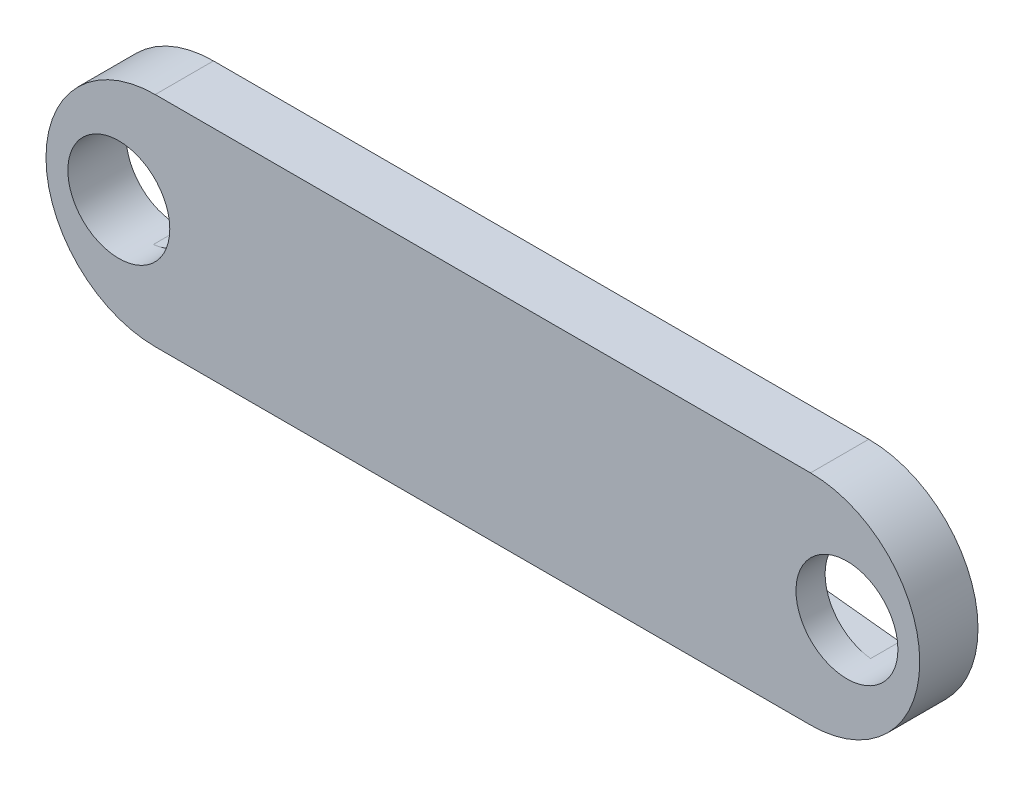
ISO-10303-21;
HEADER;
FILE_DESCRIPTION(('STEP AP214'),'2;1');
FILE_NAME('part.step','',(''),(''),'','','');
FILE_SCHEMA(('AUTOMOTIVE_DESIGN { 1 0 10303 214 1 1 1 1 }'));
ENDSEC;
DATA;
#1=APPLICATION_CONTEXT('core data for automotive mechanical design processes');
#2=APPLICATION_PROTOCOL_DEFINITION('international standard','automotive_design',2000,#1);
#3=PRODUCT_CONTEXT('',#1,'mechanical');
#4=PRODUCT('Part','Part','',(#3));
#5=PRODUCT_RELATED_PRODUCT_CATEGORY('part','',(#4));
#6=PRODUCT_DEFINITION_FORMATION('','',#4);
#7=PRODUCT_DEFINITION_CONTEXT('part definition',#1,'design');
#8=PRODUCT_DEFINITION('design','',#6,#7);
#9=PRODUCT_DEFINITION_SHAPE('','',#8);
#10=(LENGTH_UNIT() NAMED_UNIT(*) SI_UNIT(.MILLI.,.METRE.));
#11=(NAMED_UNIT(*) PLANE_ANGLE_UNIT() SI_UNIT($,.RADIAN.));
#12=(NAMED_UNIT(*) SI_UNIT($,.STERADIAN.) SOLID_ANGLE_UNIT());
#13=UNCERTAINTY_MEASURE_WITH_UNIT(LENGTH_MEASURE(1.E-05),#10,'distance_accuracy_value','');
#14=(GEOMETRIC_REPRESENTATION_CONTEXT(3) GLOBAL_UNCERTAINTY_ASSIGNED_CONTEXT((#13)) GLOBAL_UNIT_ASSIGNED_CONTEXT((#10,
#11,#12)) REPRESENTATION_CONTEXT('',''));
#15=CARTESIAN_POINT('',(0.,0.,0.));
#16=DIRECTION('',(0.,0.,1.));
#17=DIRECTION('',(1.,0.,0.));
#18=AXIS2_PLACEMENT_3D('',#15,#16,#17);
#19=CARTESIAN_POINT('',(-47.5,9.18674698795181,4.));
#20=DIRECTION('',(0.,0.,-1.));
#21=DIRECTION('',(-1.,0.,0.));
#22=AXIS2_PLACEMENT_3D('',#19,#20,#21);
#23=CYLINDRICAL_SURFACE('',#22,7.5);
#24=DIRECTION('',(0.,0.,-1.));
#25=VECTOR('',#24,1.);
#26=CARTESIAN_POINT('',(-47.5,1.68674698795181,4.));
#27=LINE('',#26,#25);
#28=CARTESIAN_POINT('',(-47.5,1.68674698795181,4.));
#29=VERTEX_POINT('',#28);
#30=CARTESIAN_POINT('',(-47.5,1.68674698795181,0.));
#31=VERTEX_POINT('',#30);
#32=EDGE_CURVE('E218',#29,#31,#27,.T.);
#33=ORIENTED_EDGE('',*,*,#32,.F.);
#34=CARTESIAN_POINT('',(-47.5,9.18674698795181,4.));
#35=DIRECTION('',(0.,0.,1.));
#36=DIRECTION('',(1.,0.,0.));
#37=AXIS2_PLACEMENT_3D('',#34,#35,#36);
#38=CIRCLE('',#37,7.5);
#39=CARTESIAN_POINT('',(-47.5,16.6867469879518,4.));
#40=VERTEX_POINT('',#39);
#41=EDGE_CURVE('E224',#40,#29,#38,.T.);
#42=ORIENTED_EDGE('',*,*,#41,.F.);
#43=DIRECTION('',(0.,0.,-1.));
#44=VECTOR('',#43,1.);
#45=CARTESIAN_POINT('',(-47.5,16.6867469879518,4.));
#46=LINE('',#45,#44);
#47=CARTESIAN_POINT('',(-47.5,16.6867469879518,0.));
#48=VERTEX_POINT('',#47);
#49=EDGE_CURVE('E221',#48,#40,#46,.F.);
#50=ORIENTED_EDGE('',*,*,#49,.F.);
#51=CARTESIAN_POINT('',(-47.5,9.18674698795181,0.));
#52=DIRECTION('',(0.,0.,1.));
#53=DIRECTION('',(1.,0.,0.));
#54=AXIS2_PLACEMENT_3D('',#51,#52,#53);
#55=CIRCLE('',#54,7.5);
#56=EDGE_CURVE('E226',#31,#48,#55,.F.);
#57=ORIENTED_EDGE('',*,*,#56,.F.);
#58=EDGE_LOOP('',(#33,#42,#50,#57));
#59=FACE_BOUND('',#58,.T.);
#60=ADVANCED_FACE('F41',(#59),#23,.T.);
#61=CARTESIAN_POINT('',(-2.5,9.18674698795181,4.));
#62=DIRECTION('',(0.,0.,-1.));
#63=DIRECTION('',(-1.,0.,0.));
#64=AXIS2_PLACEMENT_3D('',#61,#62,#63);
#65=CYLINDRICAL_SURFACE('',#64,7.5);
#66=DIRECTION('',(0.,0.,-1.));
#67=VECTOR('',#66,1.);
#68=CARTESIAN_POINT('',(-2.5,16.6867469879518,4.));
#69=LINE('',#68,#67);
#70=CARTESIAN_POINT('',(-2.5,16.6867469879518,4.));
#71=VERTEX_POINT('',#70);
#72=CARTESIAN_POINT('',(-2.5,16.6867469879518,0.));
#73=VERTEX_POINT('',#72);
#74=EDGE_CURVE('E204',#71,#73,#69,.T.);
#75=ORIENTED_EDGE('',*,*,#74,.F.);
#76=CARTESIAN_POINT('',(-2.5,9.18674698795181,4.));
#77=DIRECTION('',(0.,0.,1.));
#78=DIRECTION('',(1.,0.,0.));
#79=AXIS2_PLACEMENT_3D('',#76,#77,#78);
#80=CIRCLE('',#79,7.5);
#81=CARTESIAN_POINT('',(-2.5,1.68674698795181,4.));
#82=VERTEX_POINT('',#81);
#83=EDGE_CURVE('E213',#82,#71,#80,.T.);
#84=ORIENTED_EDGE('',*,*,#83,.F.);
#85=DIRECTION('',(0.,0.,-1.));
#86=VECTOR('',#85,1.);
#87=CARTESIAN_POINT('',(-2.5,1.68674698795181,4.));
#88=LINE('',#87,#86);
#89=CARTESIAN_POINT('',(-2.5,1.68674698795181,0.));
#90=VERTEX_POINT('',#89);
#91=EDGE_CURVE('E210',#90,#82,#88,.F.);
#92=ORIENTED_EDGE('',*,*,#91,.F.);
#93=CARTESIAN_POINT('',(-2.5,9.18674698795181,0.));
#94=DIRECTION('',(0.,0.,1.));
#95=DIRECTION('',(1.,0.,0.));
#96=AXIS2_PLACEMENT_3D('',#93,#94,#95);
#97=CIRCLE('',#96,7.5);
#98=EDGE_CURVE('E215',#73,#90,#97,.F.);
#99=ORIENTED_EDGE('',*,*,#98,.F.);
#100=EDGE_LOOP('',(#75,#84,#92,#99));
#101=FACE_BOUND('',#100,.T.);
#102=ADVANCED_FACE('F267',(#101),#65,.T.);
#103=CARTESIAN_POINT('',(0.,0.,4.));
#104=DIRECTION('',(0.,0.,1.));
#105=DIRECTION('',(1.,0.,0.));
#106=AXIS2_PLACEMENT_3D('',#103,#104,#105);
#107=PLANE('',#106);
#108=CARTESIAN_POINT('',(-50.,9.18674698795181,4.));
#109=DIRECTION('',(0.,0.,1.));
#110=DIRECTION('',(1.,0.,0.));
#111=AXIS2_PLACEMENT_3D('',#108,#109,#110);
#112=CIRCLE('',#111,3.50000000000003);
#113=CARTESIAN_POINT('',(-46.5,9.18674698795181,4.));
#114=VERTEX_POINT('',#113);
#115=EDGE_CURVE('E159',#114,#114,#112,.T.);
#116=ORIENTED_EDGE('',*,*,#115,.F.);
#117=EDGE_LOOP('',(#116));
#118=FACE_BOUND('',#117,.T.);
#119=CARTESIAN_POINT('',(0.,9.18674698795181,4.));
#120=DIRECTION('',(0.,0.,1.));
#121=DIRECTION('',(1.,0.,0.));
#122=AXIS2_PLACEMENT_3D('',#119,#120,#121);
#123=CIRCLE('',#122,3.50000000000001);
#124=CARTESIAN_POINT('',(3.50000000000001,9.18674698795181,4.));
#125=VERTEX_POINT('',#124);
#126=EDGE_CURVE('E143',#125,#125,#123,.T.);
#127=ORIENTED_EDGE('',*,*,#126,.F.);
#128=EDGE_LOOP('',(#127));
#129=FACE_BOUND('',#128,.T.);
#130=DIRECTION('',(-1.,0.,0.));
#131=VECTOR('',#130,1.);
#132=CARTESIAN_POINT('',(-55.,16.6867469879518,4.));
#133=LINE('',#132,#131);
#134=EDGE_CURVE('E198',#71,#40,#133,.T.);
#135=ORIENTED_EDGE('',*,*,#134,.T.);
#136=ORIENTED_EDGE('',*,*,#41,.T.);
#137=DIRECTION('',(1.,0.,0.));
#138=VECTOR('',#137,1.);
#139=CARTESIAN_POINT('',(-55.,1.68674698795181,4.));
#140=LINE('',#139,#138);
#141=EDGE_CURVE('E201',#29,#82,#140,.T.);
#142=ORIENTED_EDGE('',*,*,#141,.T.);
#143=ORIENTED_EDGE('',*,*,#83,.T.);
#144=EDGE_LOOP('',(#135,#136,#142,#143));
#145=FACE_BOUND('',#144,.T.);
#146=ADVANCED_FACE('F250',(#118,#129,#145),#107,.T.);
#147=CARTESIAN_POINT('',(0.,0.,0.));
#148=DIRECTION('',(0.,0.,1.));
#149=DIRECTION('',(1.,0.,0.));
#150=AXIS2_PLACEMENT_3D('',#147,#148,#149);
#151=PLANE('',#150);
#152=DIRECTION('',(0.994243636219647,-0.107142857142857,0.));
#153=VECTOR('',#152,1.);
#154=CARTESIAN_POINT('',(-49.625,12.6665997147206,0.));
#155=LINE('',#154,#153);
#156=CARTESIAN_POINT('',(-49.625,12.6665997147206,0.));
#157=VERTEX_POINT('',#156);
#158=CARTESIAN_POINT('',(-35.7857142857143,11.1752342603911,0.));
#159=VERTEX_POINT('',#158);
#160=EDGE_CURVE('E158',#157,#159,#155,.T.);
#161=ORIENTED_EDGE('',*,*,#160,.F.);
#162=CARTESIAN_POINT('',(-50.,9.18674698795183,0.));
#163=DIRECTION('',(0.,0.,-1.));
#164=DIRECTION('',(1.,0.,0.));
#165=AXIS2_PLACEMENT_3D('',#162,#163,#164);
#166=CIRCLE('',#165,3.5);
#167=CARTESIAN_POINT('',(-49.625,5.70689426118307,0.));
#168=VERTEX_POINT('',#167);
#169=EDGE_CURVE('E56',#168,#157,#166,.T.);
#170=ORIENTED_EDGE('',*,*,#169,.F.);
#171=DIRECTION('',(-0.994243636219647,-0.107142857142857,0.));
#172=VECTOR('',#171,1.);
#173=CARTESIAN_POINT('',(-35.7857142857143,7.19825971551254,0.));
#174=LINE('',#173,#172);
#175=CARTESIAN_POINT('',(-35.7857142857143,7.19825971551254,0.));
#176=VERTEX_POINT('',#175);
#177=EDGE_CURVE('E142',#176,#168,#174,.T.);
#178=ORIENTED_EDGE('',*,*,#177,.F.);
#179=CARTESIAN_POINT('',(-36.,9.18674698795183,0.));
#180=DIRECTION('',(0.,0.,-1.));
#181=DIRECTION('',(-1.,0.,0.));
#182=AXIS2_PLACEMENT_3D('',#179,#180,#181);
#183=CIRCLE('',#182,2.);
#184=EDGE_CURVE('E162',#159,#176,#183,.T.);
#185=ORIENTED_EDGE('',*,*,#184,.F.);
#186=EDGE_LOOP('',(#161,#170,#178,#185));
#187=FACE_BOUND('',#186,.T.);
#188=DIRECTION('',(0.994243636219647,0.107142857142857,0.));
#189=VECTOR('',#188,1.);
#190=CARTESIAN_POINT('',(-14.2142857142857,11.1752342603911,0.));
#191=LINE('',#190,#189);
#192=CARTESIAN_POINT('',(-14.2142857142857,11.1752342603911,0.));
#193=VERTEX_POINT('',#192);
#194=CARTESIAN_POINT('',(-0.375000000000005,12.6665997147206,0.));
#195=VERTEX_POINT('',#194);
#196=EDGE_CURVE('E182',#193,#195,#191,.T.);
#197=ORIENTED_EDGE('',*,*,#196,.F.);
#198=CARTESIAN_POINT('',(-14.,9.18674698795181,0.));
#199=DIRECTION('',(0.,0.,-1.));
#200=DIRECTION('',(1.,0.,0.));
#201=AXIS2_PLACEMENT_3D('',#198,#199,#200);
#202=CIRCLE('',#201,2.);
#203=CARTESIAN_POINT('',(-14.2142857142857,7.19825971551252,0.));
#204=VERTEX_POINT('',#203);
#205=EDGE_CURVE('E64',#204,#193,#202,.T.);
#206=ORIENTED_EDGE('',*,*,#205,.F.);
#207=DIRECTION('',(-0.994243636219647,0.107142857142857,0.));
#208=VECTOR('',#207,1.);
#209=CARTESIAN_POINT('',(-14.2142857142857,7.19825971551252,0.));
#210=LINE('',#209,#208);
#211=CARTESIAN_POINT('',(-0.375000000000004,5.70689426118305,0.));
#212=VERTEX_POINT('',#211);
#213=EDGE_CURVE('E174',#212,#204,#210,.T.);
#214=ORIENTED_EDGE('',*,*,#213,.F.);
#215=CARTESIAN_POINT('',(0.,9.18674698795181,0.));
#216=DIRECTION('',(0.,0.,-1.));
#217=DIRECTION('',(1.,0.,0.));
#218=AXIS2_PLACEMENT_3D('',#215,#216,#217);
#219=CIRCLE('',#218,3.5);
#220=EDGE_CURVE('E185',#195,#212,#219,.T.);
#221=ORIENTED_EDGE('',*,*,#220,.F.);
#222=EDGE_LOOP('',(#197,#206,#214,#221));
#223=FACE_BOUND('',#222,.T.);
#224=DIRECTION('',(1.,0.,0.));
#225=VECTOR('',#224,1.);
#226=CARTESIAN_POINT('',(-55.,1.68674698795181,0.));
#227=LINE('',#226,#225);
#228=EDGE_CURVE('E202',#31,#90,#227,.T.);
#229=ORIENTED_EDGE('',*,*,#228,.F.);
#230=ORIENTED_EDGE('',*,*,#56,.T.);
#231=DIRECTION('',(-1.,0.,0.));
#232=VECTOR('',#231,1.);
#233=CARTESIAN_POINT('',(-55.,16.6867469879518,0.));
#234=LINE('',#233,#232);
#235=EDGE_CURVE('E192',#73,#48,#234,.T.);
#236=ORIENTED_EDGE('',*,*,#235,.F.);
#237=ORIENTED_EDGE('',*,*,#98,.T.);
#238=EDGE_LOOP('',(#229,#230,#236,#237));
#239=FACE_BOUND('',#238,.T.);
#240=ADVANCED_FACE('F246',(#187,#223,#239),#151,.F.);
#241=CARTESIAN_POINT('',(-55.,16.6867469879518,4.));
#242=DIRECTION('',(0.,-1.,0.));
#243=DIRECTION('',(0.,0.,-1.));
#244=AXIS2_PLACEMENT_3D('',#241,#242,#243);
#245=PLANE('',#244);
#246=ORIENTED_EDGE('',*,*,#235,.T.);
#247=ORIENTED_EDGE('',*,*,#49,.T.);
#248=ORIENTED_EDGE('',*,*,#134,.F.);
#249=ORIENTED_EDGE('',*,*,#74,.T.);
#250=EDGE_LOOP('',(#246,#247,#248,#249));
#251=FACE_BOUND('',#250,.T.);
#252=ADVANCED_FACE('F249',(#251),#245,.F.);
#253=CARTESIAN_POINT('',(-55.,1.68674698795181,4.));
#254=DIRECTION('',(0.,1.,0.));
#255=DIRECTION('',(0.,0.,1.));
#256=AXIS2_PLACEMENT_3D('',#253,#254,#255);
#257=PLANE('',#256);
#258=ORIENTED_EDGE('',*,*,#141,.F.);
#259=ORIENTED_EDGE('',*,*,#32,.T.);
#260=ORIENTED_EDGE('',*,*,#228,.T.);
#261=ORIENTED_EDGE('',*,*,#91,.T.);
#262=EDGE_LOOP('',(#258,#259,#260,#261));
#263=FACE_BOUND('',#262,.T.);
#264=ADVANCED_FACE('F259',(#263),#257,.F.);
#265=CARTESIAN_POINT('',(-14.,9.18674698795181,2.));
#266=DIRECTION('',(0.,0.,-1.));
#267=DIRECTION('',(-1.,0.,0.));
#268=AXIS2_PLACEMENT_3D('',#265,#266,#267);
#269=CYLINDRICAL_SURFACE('',#268,2.);
#270=ORIENTED_EDGE('',*,*,#205,.T.);
#271=DIRECTION('',(0.,0.,-1.));
#272=VECTOR('',#271,1.);
#273=CARTESIAN_POINT('',(-14.2142857142857,11.1752342603911,2.));
#274=LINE('',#273,#272);
#275=CARTESIAN_POINT('',(-14.2142857142857,11.1752342603911,2.));
#276=VERTEX_POINT('',#275);
#277=EDGE_CURVE('E180',#276,#193,#274,.T.);
#278=ORIENTED_EDGE('',*,*,#277,.F.);
#279=CARTESIAN_POINT('',(-14.,9.18674698795181,2.));
#280=DIRECTION('',(0.,0.,-1.));
#281=DIRECTION('',(1.,0.,0.));
#282=AXIS2_PLACEMENT_3D('',#279,#280,#281);
#283=CIRCLE('',#282,2.);
#284=CARTESIAN_POINT('',(-14.2142857142857,7.19825971551252,2.));
#285=VERTEX_POINT('',#284);
#286=EDGE_CURVE('E170',#285,#276,#283,.T.);
#287=ORIENTED_EDGE('',*,*,#286,.F.);
#288=DIRECTION('',(0.,0.,-1.));
#289=VECTOR('',#288,1.);
#290=CARTESIAN_POINT('',(-14.2142857142857,7.19825971551252,2.));
#291=LINE('',#290,#289);
#292=EDGE_CURVE('E190',#285,#204,#291,.T.);
#293=ORIENTED_EDGE('',*,*,#292,.T.);
#294=EDGE_LOOP('',(#270,#278,#287,#293));
#295=FACE_BOUND('',#294,.T.);
#296=ADVANCED_FACE('F241',(#295),#269,.F.);
#297=CARTESIAN_POINT('',(-14.2142857142857,7.19825971551252,2.));
#298=DIRECTION('',(-0.107142857142857,-0.994243636219647,0.));
#299=DIRECTION('',(0.994243636219647,-0.107142857142857,0.));
#300=AXIS2_PLACEMENT_3D('',#297,#298,#299);
#301=PLANE('',#300);
#302=ORIENTED_EDGE('',*,*,#213,.T.);
#303=ORIENTED_EDGE('',*,*,#292,.F.);
#304=DIRECTION('',(-0.994243636219647,0.107142857142857,0.));
#305=VECTOR('',#304,1.);
#306=CARTESIAN_POINT('',(-14.2142857142857,7.19825971551252,2.));
#307=LINE('',#306,#305);
#308=CARTESIAN_POINT('',(-0.375000000000005,5.70689426118304,2.));
#309=VERTEX_POINT('',#308);
#310=EDGE_CURVE('E177',#309,#285,#307,.T.);
#311=ORIENTED_EDGE('',*,*,#310,.F.);
#312=DIRECTION('',(0.,0.,-1.));
#313=VECTOR('',#312,1.);
#314=CARTESIAN_POINT('',(-0.375000000000004,5.70689426118305,2.));
#315=LINE('',#314,#313);
#316=EDGE_CURVE('E193',#309,#212,#315,.T.);
#317=ORIENTED_EDGE('',*,*,#316,.T.);
#318=EDGE_LOOP('',(#302,#303,#311,#317));
#319=FACE_BOUND('',#318,.T.);
#320=ADVANCED_FACE('F239',(#319),#301,.F.);
#321=CARTESIAN_POINT('',(0.,9.18674698795181,2.));
#322=DIRECTION('',(0.,0.,-1.));
#323=DIRECTION('',(-1.,0.,0.));
#324=AXIS2_PLACEMENT_3D('',#321,#322,#323);
#325=CYLINDRICAL_SURFACE('',#324,3.5);
#326=ORIENTED_EDGE('',*,*,#220,.T.);
#327=ORIENTED_EDGE('',*,*,#316,.F.);
#328=CARTESIAN_POINT('',(0.,9.18674698795181,2.));
#329=DIRECTION('',(0.,0.,1.));
#330=DIRECTION('',(1.,0.,0.));
#331=AXIS2_PLACEMENT_3D('',#328,#329,#330);
#332=CIRCLE('',#331,3.50000000000001);
#333=CARTESIAN_POINT('',(-0.375000000000005,12.6665997147206,2.));
#334=VERTEX_POINT('',#333);
#335=EDGE_CURVE('E49',#334,#309,#332,.T.);
#336=ORIENTED_EDGE('',*,*,#335,.F.);
#337=DIRECTION('',(0.,0.,-1.));
#338=VECTOR('',#337,1.);
#339=CARTESIAN_POINT('',(-0.375000000000005,12.6665997147206,2.));
#340=LINE('',#339,#338);
#341=EDGE_CURVE('E195',#334,#195,#340,.T.);
#342=ORIENTED_EDGE('',*,*,#341,.T.);
#343=EDGE_LOOP('',(#326,#327,#336,#342));
#344=FACE_BOUND('',#343,.T.);
#345=ORIENTED_EDGE('',*,*,#126,.T.);
#346=EDGE_LOOP('',(#345));
#347=FACE_BOUND('',#346,.T.);
#348=ADVANCED_FACE('F234',(#344,#347),#325,.F.);
#349=CARTESIAN_POINT('',(-14.2142857142857,11.1752342603911,2.));
#350=DIRECTION('',(-0.107142857142857,0.994243636219647,0.));
#351=DIRECTION('',(-0.994243636219647,-0.107142857142857,0.));
#352=AXIS2_PLACEMENT_3D('',#349,#350,#351);
#353=PLANE('',#352);
#354=ORIENTED_EDGE('',*,*,#196,.T.);
#355=ORIENTED_EDGE('',*,*,#341,.F.);
#356=DIRECTION('',(0.994243636219647,0.107142857142857,0.));
#357=VECTOR('',#356,1.);
#358=CARTESIAN_POINT('',(-14.2142857142857,11.1752342603911,2.));
#359=LINE('',#358,#357);
#360=EDGE_CURVE('E173',#276,#334,#359,.T.);
#361=ORIENTED_EDGE('',*,*,#360,.F.);
#362=ORIENTED_EDGE('',*,*,#277,.T.);
#363=EDGE_LOOP('',(#354,#355,#361,#362));
#364=FACE_BOUND('',#363,.T.);
#365=ADVANCED_FACE('F244',(#364),#353,.F.);
#366=CARTESIAN_POINT('',(-14.,9.18674698795181,2.));
#367=DIRECTION('',(0.,0.,1.));
#368=DIRECTION('',(1.,0.,0.));
#369=AXIS2_PLACEMENT_3D('',#366,#367,#368);
#370=PLANE('',#369);
#371=ORIENTED_EDGE('',*,*,#360,.T.);
#372=ORIENTED_EDGE('',*,*,#335,.T.);
#373=ORIENTED_EDGE('',*,*,#310,.T.);
#374=ORIENTED_EDGE('',*,*,#286,.T.);
#375=EDGE_LOOP('',(#371,#372,#373,#374));
#376=FACE_BOUND('',#375,.T.);
#377=ADVANCED_FACE('F229',(#376),#370,.F.);
#378=CARTESIAN_POINT('',(-50.,9.18674698795183,2.));
#379=DIRECTION('',(0.,0.,-1.));
#380=DIRECTION('',(-1.,0.,0.));
#381=AXIS2_PLACEMENT_3D('',#378,#379,#380);
#382=CYLINDRICAL_SURFACE('',#381,3.5);
#383=ORIENTED_EDGE('',*,*,#169,.T.);
#384=DIRECTION('',(0.,0.,-1.));
#385=VECTOR('',#384,1.);
#386=CARTESIAN_POINT('',(-49.625,12.6665997147206,2.));
#387=LINE('',#386,#385);
#388=CARTESIAN_POINT('',(-49.625,12.6665997147206,2.));
#389=VERTEX_POINT('',#388);
#390=EDGE_CURVE('E132',#389,#157,#387,.T.);
#391=ORIENTED_EDGE('',*,*,#390,.F.);
#392=CARTESIAN_POINT('',(-50.,9.18674698795181,2.));
#393=DIRECTION('',(0.,0.,1.));
#394=DIRECTION('',(1.,0.,0.));
#395=AXIS2_PLACEMENT_3D('',#392,#393,#394);
#396=CIRCLE('',#395,3.50000000000003);
#397=CARTESIAN_POINT('',(-49.625,5.70689426118307,2.));
#398=VERTEX_POINT('',#397);
#399=EDGE_CURVE('E11',#398,#389,#396,.T.);
#400=ORIENTED_EDGE('',*,*,#399,.F.);
#401=DIRECTION('',(0.,0.,-1.));
#402=VECTOR('',#401,1.);
#403=CARTESIAN_POINT('',(-49.625,5.70689426118307,2.));
#404=LINE('',#403,#402);
#405=EDGE_CURVE('E130',#398,#168,#404,.T.);
#406=ORIENTED_EDGE('',*,*,#405,.T.);
#407=EDGE_LOOP('',(#383,#391,#400,#406));
#408=FACE_BOUND('',#407,.T.);
#409=ORIENTED_EDGE('',*,*,#115,.T.);
#410=EDGE_LOOP('',(#409));
#411=FACE_BOUND('',#410,.T.);
#412=ADVANCED_FACE('F128',(#408,#411),#382,.F.);
#413=CARTESIAN_POINT('',(-35.7857142857143,7.19825971551254,2.));
#414=DIRECTION('',(0.107142857142857,-0.994243636219647,0.));
#415=DIRECTION('',(0.994243636219647,0.107142857142857,0.));
#416=AXIS2_PLACEMENT_3D('',#413,#414,#415);
#417=PLANE('',#416);
#418=ORIENTED_EDGE('',*,*,#177,.T.);
#419=ORIENTED_EDGE('',*,*,#405,.F.);
#420=DIRECTION('',(-0.994243636219647,-0.107142857142857,0.));
#421=VECTOR('',#420,1.);
#422=CARTESIAN_POINT('',(-35.7857142857143,7.19825971551254,2.));
#423=LINE('',#422,#421);
#424=CARTESIAN_POINT('',(-35.7857142857143,7.19825971551254,2.));
#425=VERTEX_POINT('',#424);
#426=EDGE_CURVE('E140',#425,#398,#423,.T.);
#427=ORIENTED_EDGE('',*,*,#426,.F.);
#428=DIRECTION('',(0.,0.,-1.));
#429=VECTOR('',#428,1.);
#430=CARTESIAN_POINT('',(-35.7857142857143,7.19825971551254,2.));
#431=LINE('',#430,#429);
#432=EDGE_CURVE('E144',#425,#176,#431,.T.);
#433=ORIENTED_EDGE('',*,*,#432,.T.);
#434=EDGE_LOOP('',(#418,#419,#427,#433));
#435=FACE_BOUND('',#434,.T.);
#436=ADVANCED_FACE('F139',(#435),#417,.F.);
#437=CARTESIAN_POINT('',(-36.,9.18674698795183,2.));
#438=DIRECTION('',(0.,0.,-1.));
#439=DIRECTION('',(-1.,0.,0.));
#440=AXIS2_PLACEMENT_3D('',#437,#438,#439);
#441=CYLINDRICAL_SURFACE('',#440,2.);
#442=ORIENTED_EDGE('',*,*,#184,.T.);
#443=ORIENTED_EDGE('',*,*,#432,.F.);
#444=CARTESIAN_POINT('',(-36.,9.18674698795183,2.));
#445=DIRECTION('',(0.,0.,-1.));
#446=DIRECTION('',(-1.,0.,0.));
#447=AXIS2_PLACEMENT_3D('',#444,#445,#446);
#448=CIRCLE('',#447,2.);
#449=CARTESIAN_POINT('',(-35.7857142857143,11.1752342603911,2.));
#450=VERTEX_POINT('',#449);
#451=EDGE_CURVE('E149',#450,#425,#448,.T.);
#452=ORIENTED_EDGE('',*,*,#451,.F.);
#453=DIRECTION('',(0.,0.,-1.));
#454=VECTOR('',#453,1.);
#455=CARTESIAN_POINT('',(-35.7857142857143,11.1752342603911,2.));
#456=LINE('',#455,#454);
#457=EDGE_CURVE('E151',#450,#159,#456,.T.);
#458=ORIENTED_EDGE('',*,*,#457,.T.);
#459=EDGE_LOOP('',(#442,#443,#452,#458));
#460=FACE_BOUND('',#459,.T.);
#461=ADVANCED_FACE('F341',(#460),#441,.F.);
#462=CARTESIAN_POINT('',(-49.625,12.6665997147206,2.));
#463=DIRECTION('',(0.107142857142857,0.994243636219647,0.));
#464=DIRECTION('',(-0.994243636219647,0.107142857142857,0.));
#465=AXIS2_PLACEMENT_3D('',#462,#463,#464);
#466=PLANE('',#465);
#467=ORIENTED_EDGE('',*,*,#160,.T.);
#468=ORIENTED_EDGE('',*,*,#457,.F.);
#469=DIRECTION('',(0.994243636219647,-0.107142857142857,0.));
#470=VECTOR('',#469,1.);
#471=CARTESIAN_POINT('',(-49.625,12.6665997147206,2.));
#472=LINE('',#471,#470);
#473=EDGE_CURVE('E153',#389,#450,#472,.T.);
#474=ORIENTED_EDGE('',*,*,#473,.F.);
#475=ORIENTED_EDGE('',*,*,#390,.T.);
#476=EDGE_LOOP('',(#467,#468,#474,#475));
#477=FACE_BOUND('',#476,.T.);
#478=ADVANCED_FACE('F344',(#477),#466,.F.);
#479=CARTESIAN_POINT('',(-50.,9.18674698795183,2.));
#480=DIRECTION('',(0.,0.,1.));
#481=DIRECTION('',(1.,0.,0.));
#482=AXIS2_PLACEMENT_3D('',#479,#480,#481);
#483=PLANE('',#482);
#484=ORIENTED_EDGE('',*,*,#426,.T.);
#485=ORIENTED_EDGE('',*,*,#399,.T.);
#486=ORIENTED_EDGE('',*,*,#473,.T.);
#487=ORIENTED_EDGE('',*,*,#451,.T.);
#488=EDGE_LOOP('',(#484,#485,#486,#487));
#489=FACE_BOUND('',#488,.T.);
#490=ADVANCED_FACE('F147',(#489),#483,.F.);
#491=CLOSED_SHELL('',(#60,#102,#146,#240,#252,#264,#296,#320,#348,#365,#377,#412,#436,#461,#478,#490));
#492=MANIFOLD_SOLID_BREP('B2',#491);
#493=ADVANCED_BREP_SHAPE_REPRESENTATION('',(#18,#492),#14);
#494=SHAPE_DEFINITION_REPRESENTATION(#9,#493);
ENDSEC;
END-ISO-10303-21;
